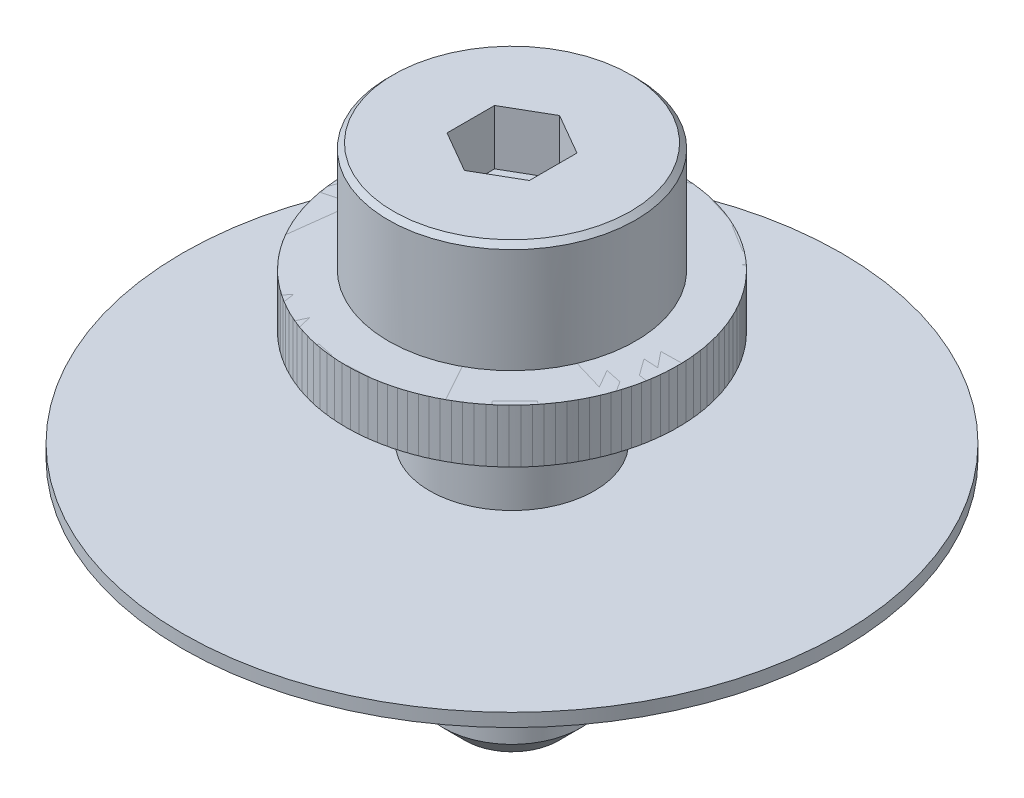
ISO-10303-21;
HEADER;
FILE_DESCRIPTION(('STEP AP214'),'2;1');
FILE_NAME('part.step','',(''),(''),'','','');
FILE_SCHEMA(('AUTOMOTIVE_DESIGN { 1 0 10303 214 1 1 1 1 }'));
ENDSEC;
DATA;
#1=APPLICATION_CONTEXT('core data for automotive mechanical design processes');
#2=APPLICATION_PROTOCOL_DEFINITION('international standard','automotive_design',2000,#1);
#3=PRODUCT_CONTEXT('',#1,'mechanical');
#4=PRODUCT('Part','Part','',(#3));
#5=PRODUCT_RELATED_PRODUCT_CATEGORY('part','',(#4));
#6=PRODUCT_DEFINITION_FORMATION('','',#4);
#7=PRODUCT_DEFINITION_CONTEXT('part definition',#1,'design');
#8=PRODUCT_DEFINITION('design','',#6,#7);
#9=PRODUCT_DEFINITION_SHAPE('','',#8);
#10=(LENGTH_UNIT() NAMED_UNIT(*) SI_UNIT(.MILLI.,.METRE.));
#11=(NAMED_UNIT(*) PLANE_ANGLE_UNIT() SI_UNIT($,.RADIAN.));
#12=(NAMED_UNIT(*) SI_UNIT($,.STERADIAN.) SOLID_ANGLE_UNIT());
#13=UNCERTAINTY_MEASURE_WITH_UNIT(LENGTH_MEASURE(1.E-05),#10,'distance_accuracy_value','');
#14=(GEOMETRIC_REPRESENTATION_CONTEXT(3) GLOBAL_UNCERTAINTY_ASSIGNED_CONTEXT((#13)) GLOBAL_UNIT_ASSIGNED_CONTEXT((#10,
#11,#12)) REPRESENTATION_CONTEXT('',''));
#15=CARTESIAN_POINT('',(0.,0.,0.));
#16=DIRECTION('',(0.,0.,1.));
#17=DIRECTION('',(1.,0.,0.));
#18=AXIS2_PLACEMENT_3D('',#15,#16,#17);
#19=CARTESIAN_POINT('',(0.,-3.0988,0.));
#20=DIRECTION('',(0.,1.,0.));
#21=DIRECTION('',(0.,0.,1.));
#22=AXIS2_PLACEMENT_3D('',#19,#20,#21);
#23=CYLINDRICAL_SURFACE('',#22,9.5885);
#24=CARTESIAN_POINT('',(0.,-3.0988,0.));
#25=DIRECTION('',(0.,-1.,0.));
#26=DIRECTION('',(0.,0.,-1.));
#27=AXIS2_PLACEMENT_3D('',#24,#25,#26);
#28=CIRCLE('',#27,9.5885);
#29=CARTESIAN_POINT('',(0.,-3.0988,-9.5885));
#30=VERTEX_POINT('',#29);
#31=EDGE_CURVE('P0_E10',#30,#30,#28,.T.);
#32=ORIENTED_EDGE('',*,*,#31,.F.);
#33=EDGE_LOOP('',(#32));
#34=FACE_BOUND('',#33,.T.);
#35=CARTESIAN_POINT('',(0.,0.,0.));
#36=DIRECTION('',(0.,-1.,0.));
#37=DIRECTION('',(0.,0.,-1.));
#38=AXIS2_PLACEMENT_3D('',#35,#36,#37);
#39=CIRCLE('',#38,9.5885);
#40=CARTESIAN_POINT('',(0.,0.,-9.5885));
#41=VERTEX_POINT('',#40);
#42=EDGE_CURVE('P0_E37',#41,#41,#39,.T.);
#43=ORIENTED_EDGE('',*,*,#42,.T.);
#44=EDGE_LOOP('',(#43));
#45=FACE_BOUND('',#44,.T.);
#46=ADVANCED_FACE('P0_F34',(#34,#45),#23,.T.);
#47=CARTESIAN_POINT('',(0.,-3.0988,0.));
#48=DIRECTION('',(0.,-1.,0.));
#49=DIRECTION('',(0.,0.,-1.));
#50=AXIS2_PLACEMENT_3D('',#47,#48,#49);
#51=PLANE('',#50);
#52=ORIENTED_EDGE('',*,*,#31,.T.);
#53=EDGE_LOOP('',(#52));
#54=FACE_BOUND('',#53,.T.);
#55=ADVANCED_FACE('P0_F51',(#54),#51,.T.);
#56=CARTESIAN_POINT('',(0.,0.,0.));
#57=DIRECTION('',(0.,-1.,0.));
#58=DIRECTION('',(0.,0.,-1.));
#59=AXIS2_PLACEMENT_3D('',#56,#57,#58);
#60=PLANE('',#59);
#61=ORIENTED_EDGE('',*,*,#42,.F.);
#62=EDGE_LOOP('',(#61));
#63=FACE_BOUND('',#62,.T.);
#64=ADVANCED_FACE('P0_F49',(#63),#60,.F.);
#65=CLOSED_SHELL('',(#46,#55,#64));
#66=MANIFOLD_SOLID_BREP('P0_B2',#65);
#67=CARTESIAN_POINT('',(0.,-9.4488,0.));
#68=DIRECTION('',(0.,1.,0.));
#69=DIRECTION('',(0.,0.,1.));
#70=AXIS2_PLACEMENT_3D('',#67,#68,#69);
#71=PLANE('',#70);
#72=CARTESIAN_POINT('',(0.,-9.4488,0.));
#73=DIRECTION('',(0.,1.,0.));
#74=DIRECTION('',(0.,0.,1.));
#75=AXIS2_PLACEMENT_3D('',#72,#73,#74);
#76=CIRCLE('',#75,19.05);
#77=CARTESIAN_POINT('',(0.,-9.4488,-19.05));
#78=VERTEX_POINT('',#77);
#79=EDGE_CURVE('P1_E32',#78,#78,#76,.T.);
#80=ORIENTED_EDGE('',*,*,#79,.F.);
#81=EDGE_LOOP('',(#80));
#82=FACE_BOUND('',#81,.T.);
#83=CARTESIAN_POINT('',(0.,-9.4488,0.));
#84=DIRECTION('',(0.,1.,0.));
#85=DIRECTION('',(0.,0.,1.));
#86=AXIS2_PLACEMENT_3D('',#83,#84,#85);
#87=CIRCLE('',#86,4.7625);
#88=CARTESIAN_POINT('',(0.,-9.4488,-4.7625));
#89=VERTEX_POINT('',#88);
#90=EDGE_CURVE('P1_E26',#89,#89,#87,.T.);
#91=ORIENTED_EDGE('',*,*,#90,.T.);
#92=EDGE_LOOP('',(#91));
#93=FACE_BOUND('',#92,.T.);
#94=ADVANCED_FACE('P1_F14',(#82,#93),#71,.F.);
#95=CARTESIAN_POINT('',(0.,-8.6868,0.));
#96=DIRECTION('',(0.,-1.,0.));
#97=DIRECTION('',(0.,0.,-1.));
#98=AXIS2_PLACEMENT_3D('',#95,#96,#97);
#99=CYLINDRICAL_SURFACE('',#98,19.05);
#100=CARTESIAN_POINT('',(0.,-8.6868,0.));
#101=DIRECTION('',(0.,1.,0.));
#102=DIRECTION('',(0.,0.,1.));
#103=AXIS2_PLACEMENT_3D('',#100,#101,#102);
#104=CIRCLE('',#103,19.05);
#105=CARTESIAN_POINT('',(0.,-8.6868,-19.05));
#106=VERTEX_POINT('',#105);
#107=EDGE_CURVE('P1_E21',#106,#106,#104,.T.);
#108=CARTESIAN_POINT('',(0.,-8.6868,-19.05));
#109=CARTESIAN_POINT('',(0.,-8.6947375,-19.05));
#110=CARTESIAN_POINT('',(0.,-8.702675,-19.05));
#111=CARTESIAN_POINT('',(0.,-8.71855,-19.05));
#112=CARTESIAN_POINT('',(0.,-8.7264875,-19.05));
#113=CARTESIAN_POINT('',(0.,-8.7423625,-19.05));
#114=CARTESIAN_POINT('',(0.,-8.7503,-19.05));
#115=CARTESIAN_POINT('',(0.,-8.766175,-19.05));
#116=CARTESIAN_POINT('',(0.,-8.7741125,-19.05));
#117=CARTESIAN_POINT('',(0.,-8.7899875,-19.05));
#118=CARTESIAN_POINT('',(0.,-8.797925,-19.05));
#119=CARTESIAN_POINT('',(0.,-8.8138,-19.05));
#120=CARTESIAN_POINT('',(0.,-8.8217375,-19.05));
#121=CARTESIAN_POINT('',(0.,-8.8376125,-19.05));
#122=CARTESIAN_POINT('',(0.,-8.84555,-19.05));
#123=CARTESIAN_POINT('',(0.,-8.861425,-19.05));
#124=CARTESIAN_POINT('',(0.,-8.8693625,-19.05));
#125=CARTESIAN_POINT('',(0.,-8.8852375,-19.05));
#126=CARTESIAN_POINT('',(0.,-8.893175,-19.05));
#127=CARTESIAN_POINT('',(0.,-8.90905,-19.05));
#128=CARTESIAN_POINT('',(0.,-8.9169875,-19.05));
#129=CARTESIAN_POINT('',(0.,-8.9328625,-19.05));
#130=CARTESIAN_POINT('',(0.,-8.9408,-19.05));
#131=CARTESIAN_POINT('',(0.,-8.956675,-19.05));
#132=CARTESIAN_POINT('',(0.,-8.9646125,-19.05));
#133=CARTESIAN_POINT('',(0.,-8.9804875,-19.05));
#134=CARTESIAN_POINT('',(0.,-8.988425,-19.05));
#135=CARTESIAN_POINT('',(0.,-9.0043,-19.05));
#136=CARTESIAN_POINT('',(0.,-9.0122375,-19.05));
#137=CARTESIAN_POINT('',(0.,-9.0281125,-19.05));
#138=CARTESIAN_POINT('',(0.,-9.03605,-19.05));
#139=CARTESIAN_POINT('',(0.,-9.051925,-19.05));
#140=CARTESIAN_POINT('',(0.,-9.0598625,-19.05));
#141=CARTESIAN_POINT('',(0.,-9.0757375,-19.05));
#142=CARTESIAN_POINT('',(0.,-9.083675,-19.05));
#143=CARTESIAN_POINT('',(0.,-9.09955,-19.05));
#144=CARTESIAN_POINT('',(0.,-9.1074875,-19.05));
#145=CARTESIAN_POINT('',(0.,-9.1233625,-19.05));
#146=CARTESIAN_POINT('',(0.,-9.1313,-19.05));
#147=CARTESIAN_POINT('',(0.,-9.147175,-19.05));
#148=CARTESIAN_POINT('',(0.,-9.1551125,-19.05));
#149=CARTESIAN_POINT('',(0.,-9.1709875,-19.05));
#150=CARTESIAN_POINT('',(0.,-9.178925,-19.05));
#151=CARTESIAN_POINT('',(0.,-9.1948,-19.05));
#152=CARTESIAN_POINT('',(0.,-9.2027375,-19.05));
#153=CARTESIAN_POINT('',(0.,-9.2186125,-19.05));
#154=CARTESIAN_POINT('',(0.,-9.22655,-19.05));
#155=CARTESIAN_POINT('',(0.,-9.242425,-19.05));
#156=CARTESIAN_POINT('',(0.,-9.2503625,-19.05));
#157=CARTESIAN_POINT('',(0.,-9.2662375,-19.05));
#158=CARTESIAN_POINT('',(0.,-9.274175,-19.05));
#159=CARTESIAN_POINT('',(0.,-9.29005,-19.05));
#160=CARTESIAN_POINT('',(0.,-9.2979875,-19.05));
#161=CARTESIAN_POINT('',(0.,-9.3138625,-19.05));
#162=CARTESIAN_POINT('',(0.,-9.3218,-19.05));
#163=CARTESIAN_POINT('',(0.,-9.337675,-19.05));
#164=CARTESIAN_POINT('',(0.,-9.3456125,-19.05));
#165=CARTESIAN_POINT('',(0.,-9.3614875,-19.05));
#166=CARTESIAN_POINT('',(0.,-9.369425,-19.05));
#167=CARTESIAN_POINT('',(0.,-9.3853,-19.05));
#168=CARTESIAN_POINT('',(0.,-9.3932375,-19.05));
#169=CARTESIAN_POINT('',(0.,-9.4091125,-19.05));
#170=CARTESIAN_POINT('',(0.,-9.41705,-19.05));
#171=CARTESIAN_POINT('',(0.,-9.432925,-19.05));
#172=CARTESIAN_POINT('',(0.,-9.4408625,-19.05));
#173=CARTESIAN_POINT('',(0.,-9.4488,-19.05));
#174=B_SPLINE_CURVE_WITH_KNOTS('',3,(#108,#109,#110,#111,#112,#113,#114,#115,#116,#117,#118,
#119,#120,#121,#122,#123,#124,#125,#126,#127,#128,#129,#130,#131,#132,#133,#134,#135,#136,#137,
#138,#139,#140,#141,#142,#143,#144,#145,#146,#147,#148,#149,#150,#151,#152,#153,#154,#155,#156,
#157,#158,#159,#160,#161,#162,#163,#164,#165,#166,#167,#168,#169,#170,#171,#172,#173),
.UNSPECIFIED.,.F.,.F.,(4,2,2,2,2,2,2,2,2,2,2,2,2,2,2,2,2,2,2,2,2,2,2,2,2,2,2,2,2,2,2,2,4),(0.,
0.0238125000000013,0.0476250000000008,0.0714375000000003,0.0952500000000016,0.119062500000001,
0.142875000000001,0.1666875,0.190500000000001,0.214312500000001,0.238125,0.261937500000002,
0.285750000000001,0.309562500000001,0.333375,0.357187500000002,0.381000000000001,
0.404812500000001,0.428625000000002,0.452437500000001,0.476250000000001,0.500062500000001,
0.523875000000002,0.547687500000001,0.571500000000001,0.595312500000002,0.619125000000002,
0.642937500000001,0.666750000000001,0.690562500000002,0.714375000000001,0.738187500000001,
0.762000000000002),.UNSPECIFIED.);
#175=EDGE_CURVE('P1_BSEAM38',#106,#78,#174,.T.);
#176=ORIENTED_EDGE('',*,*,#107,.F.);
#177=ORIENTED_EDGE('',*,*,#79,.T.);
#178=ORIENTED_EDGE('',*,*,#175,.T.);
#179=ORIENTED_EDGE('',*,*,#175,.F.);
#180=EDGE_LOOP('',(#176,#178,#177,#179));
#181=FACE_BOUND('',#180,.T.);
#182=ADVANCED_FACE('P1_F38',(#181),#99,.T.);
#183=CARTESIAN_POINT('',(0.,-8.6868,0.));
#184=DIRECTION('',(0.,1.,0.));
#185=DIRECTION('',(0.,0.,1.));
#186=AXIS2_PLACEMENT_3D('',#183,#184,#185);
#187=PLANE('',#186);
#188=ORIENTED_EDGE('',*,*,#107,.T.);
#189=EDGE_LOOP('',(#188));
#190=FACE_BOUND('',#189,.T.);
#191=CARTESIAN_POINT('',(0.,-8.6868,0.));
#192=DIRECTION('',(0.,1.,0.));
#193=DIRECTION('',(0.,0.,1.));
#194=AXIS2_PLACEMENT_3D('',#191,#192,#193);
#195=CIRCLE('',#194,4.7625);
#196=CARTESIAN_POINT('',(0.,-8.6868,-4.7625));
#197=VERTEX_POINT('',#196);
#198=EDGE_CURVE('P1_E10',#197,#197,#195,.T.);
#199=ORIENTED_EDGE('',*,*,#198,.F.);
#200=EDGE_LOOP('',(#199));
#201=FACE_BOUND('',#200,.T.);
#202=ADVANCED_FACE('P1_F46',(#190,#201),#187,.T.);
#203=CARTESIAN_POINT('',(0.,-8.6868,0.));
#204=DIRECTION('',(0.,-1.,0.));
#205=DIRECTION('',(0.,0.,-1.));
#206=AXIS2_PLACEMENT_3D('',#203,#204,#205);
#207=CYLINDRICAL_SURFACE('',#206,4.7625);
#208=CARTESIAN_POINT('',(0.,-8.6868,-4.7625));
#209=CARTESIAN_POINT('',(0.,-8.6947375,-4.7625));
#210=CARTESIAN_POINT('',(0.,-8.702675,-4.7625));
#211=CARTESIAN_POINT('',(0.,-8.71855,-4.7625));
#212=CARTESIAN_POINT('',(0.,-8.7264875,-4.7625));
#213=CARTESIAN_POINT('',(0.,-8.7423625,-4.7625));
#214=CARTESIAN_POINT('',(0.,-8.7503,-4.7625));
#215=CARTESIAN_POINT('',(0.,-8.766175,-4.7625));
#216=CARTESIAN_POINT('',(0.,-8.7741125,-4.7625));
#217=CARTESIAN_POINT('',(0.,-8.7899875,-4.7625));
#218=CARTESIAN_POINT('',(0.,-8.797925,-4.7625));
#219=CARTESIAN_POINT('',(0.,-8.8138,-4.7625));
#220=CARTESIAN_POINT('',(0.,-8.8217375,-4.7625));
#221=CARTESIAN_POINT('',(0.,-8.8376125,-4.7625));
#222=CARTESIAN_POINT('',(0.,-8.84555,-4.7625));
#223=CARTESIAN_POINT('',(0.,-8.861425,-4.7625));
#224=CARTESIAN_POINT('',(0.,-8.8693625,-4.7625));
#225=CARTESIAN_POINT('',(0.,-8.8852375,-4.7625));
#226=CARTESIAN_POINT('',(0.,-8.893175,-4.7625));
#227=CARTESIAN_POINT('',(0.,-8.90905,-4.7625));
#228=CARTESIAN_POINT('',(0.,-8.9169875,-4.7625));
#229=CARTESIAN_POINT('',(0.,-8.9328625,-4.7625));
#230=CARTESIAN_POINT('',(0.,-8.9408,-4.7625));
#231=CARTESIAN_POINT('',(0.,-8.956675,-4.7625));
#232=CARTESIAN_POINT('',(0.,-8.9646125,-4.7625));
#233=CARTESIAN_POINT('',(0.,-8.9804875,-4.7625));
#234=CARTESIAN_POINT('',(0.,-8.988425,-4.7625));
#235=CARTESIAN_POINT('',(0.,-9.0043,-4.7625));
#236=CARTESIAN_POINT('',(0.,-9.0122375,-4.7625));
#237=CARTESIAN_POINT('',(0.,-9.0281125,-4.7625));
#238=CARTESIAN_POINT('',(0.,-9.03605,-4.7625));
#239=CARTESIAN_POINT('',(0.,-9.051925,-4.7625));
#240=CARTESIAN_POINT('',(0.,-9.0598625,-4.7625));
#241=CARTESIAN_POINT('',(0.,-9.0757375,-4.7625));
#242=CARTESIAN_POINT('',(0.,-9.083675,-4.7625));
#243=CARTESIAN_POINT('',(0.,-9.09955,-4.7625));
#244=CARTESIAN_POINT('',(0.,-9.1074875,-4.7625));
#245=CARTESIAN_POINT('',(0.,-9.1233625,-4.7625));
#246=CARTESIAN_POINT('',(0.,-9.1313,-4.7625));
#247=CARTESIAN_POINT('',(0.,-9.147175,-4.7625));
#248=CARTESIAN_POINT('',(0.,-9.1551125,-4.7625));
#249=CARTESIAN_POINT('',(0.,-9.1709875,-4.7625));
#250=CARTESIAN_POINT('',(0.,-9.178925,-4.7625));
#251=CARTESIAN_POINT('',(0.,-9.1948,-4.7625));
#252=CARTESIAN_POINT('',(0.,-9.2027375,-4.7625));
#253=CARTESIAN_POINT('',(0.,-9.2186125,-4.7625));
#254=CARTESIAN_POINT('',(0.,-9.22655,-4.7625));
#255=CARTESIAN_POINT('',(0.,-9.242425,-4.7625));
#256=CARTESIAN_POINT('',(0.,-9.2503625,-4.7625));
#257=CARTESIAN_POINT('',(0.,-9.2662375,-4.7625));
#258=CARTESIAN_POINT('',(0.,-9.274175,-4.7625));
#259=CARTESIAN_POINT('',(0.,-9.29005,-4.7625));
#260=CARTESIAN_POINT('',(0.,-9.2979875,-4.7625));
#261=CARTESIAN_POINT('',(0.,-9.3138625,-4.7625));
#262=CARTESIAN_POINT('',(0.,-9.3218,-4.7625));
#263=CARTESIAN_POINT('',(0.,-9.337675,-4.7625));
#264=CARTESIAN_POINT('',(0.,-9.3456125,-4.7625));
#265=CARTESIAN_POINT('',(0.,-9.3614875,-4.7625));
#266=CARTESIAN_POINT('',(0.,-9.369425,-4.7625));
#267=CARTESIAN_POINT('',(0.,-9.3853,-4.7625));
#268=CARTESIAN_POINT('',(0.,-9.3932375,-4.7625));
#269=CARTESIAN_POINT('',(0.,-9.4091125,-4.7625));
#270=CARTESIAN_POINT('',(0.,-9.41705,-4.7625));
#271=CARTESIAN_POINT('',(0.,-9.432925,-4.7625));
#272=CARTESIAN_POINT('',(0.,-9.4408625,-4.7625));
#273=CARTESIAN_POINT('',(0.,-9.4488,-4.7625));
#274=B_SPLINE_CURVE_WITH_KNOTS('',3,(#208,#209,#210,#211,#212,#213,#214,#215,#216,#217,#218,
#219,#220,#221,#222,#223,#224,#225,#226,#227,#228,#229,#230,#231,#232,#233,#234,#235,#236,#237,
#238,#239,#240,#241,#242,#243,#244,#245,#246,#247,#248,#249,#250,#251,#252,#253,#254,#255,#256,
#257,#258,#259,#260,#261,#262,#263,#264,#265,#266,#267,#268,#269,#270,#271,#272,#273),
.UNSPECIFIED.,.F.,.F.,(4,2,2,2,2,2,2,2,2,2,2,2,2,2,2,2,2,2,2,2,2,2,2,2,2,2,2,2,2,2,2,2,4),(0.,
0.0238124999999995,0.0476249999999991,0.0714374999999986,0.0952499999999998,0.119062499999999,
0.142874999999999,0.166687499999998,0.1905,0.214312499999999,0.238124999999999,0.2619375,
0.28575,0.309562499999999,0.333374999999999,0.3571875,0.380999999999999,0.404812499999999,
0.428625,0.4524375,0.476249999999999,0.500062499999999,0.523875,0.5476875,0.571499999999999,
0.5953125,0.619125,0.642937499999999,0.666749999999999,0.6905625,0.714375,0.738187499999999,
0.762000000000001),.UNSPECIFIED.);
#275=EDGE_CURVE('P1_BSEAM16',#197,#89,#274,.T.);
#276=ORIENTED_EDGE('',*,*,#198,.T.);
#277=ORIENTED_EDGE('',*,*,#90,.F.);
#278=ORIENTED_EDGE('',*,*,#275,.T.);
#279=ORIENTED_EDGE('',*,*,#275,.F.);
#280=EDGE_LOOP('',(#276,#278,#277,#279));
#281=FACE_BOUND('',#280,.T.);
#282=ADVANCED_FACE('P1_F16',(#281),#207,.F.);
#283=CLOSED_SHELL('',(#94,#182,#202,#282));
#284=MANIFOLD_SOLID_BREP('P1_B1',#283);
#285=CARTESIAN_POINT('',(0.,6.35,0.));
#286=DIRECTION('',(0.,-1.,0.));
#287=DIRECTION('',(0.,0.,-1.));
#288=AXIS2_PLACEMENT_3D('',#285,#286,#287);
#289=CYLINDRICAL_SURFACE('',#288,7.14375);
#290=CARTESIAN_POINT('',(0.,0.,0.));
#291=DIRECTION('',(0.,-1.,0.));
#292=DIRECTION('',(0.,0.,-1.));
#293=AXIS2_PLACEMENT_3D('',#290,#291,#292);
#294=CIRCLE('',#293,7.14375);
#295=CARTESIAN_POINT('',(0.,0.,-7.14375));
#296=VERTEX_POINT('',#295);
#297=EDGE_CURVE('P2_E11',#296,#296,#294,.F.);
#298=ORIENTED_EDGE('',*,*,#297,.T.);
#299=EDGE_LOOP('',(#298));
#300=FACE_BOUND('',#299,.T.);
#301=CARTESIAN_POINT('',(0.,6.05864879756294,0.));
#302=DIRECTION('',(0.,-1.,0.));
#303=DIRECTION('',(0.,0.,-1.));
#304=AXIS2_PLACEMENT_3D('',#301,#302,#303);
#305=CIRCLE('',#304,7.14375);
#306=CARTESIAN_POINT('',(0.,6.05864879756294,-7.14375));
#307=VERTEX_POINT('',#306);
#308=EDGE_CURVE('P2_E22',#307,#307,#305,.T.);
#309=ORIENTED_EDGE('',*,*,#308,.T.);
#310=EDGE_LOOP('',(#309));
#311=FACE_BOUND('',#310,.T.);
#312=ADVANCED_FACE('P2_F16',(#300,#311),#289,.T.);
#313=CARTESIAN_POINT('',(0.,6.05864879764795,0.));
#314=DIRECTION('',(0.,-1.,0.));
#315=DIRECTION('',(1.,0.,0.));
#316=AXIS2_PLACEMENT_3D('',#313,#314,#315);
#317=CONICAL_SURFACE('',#316,7.14374999995471,0.785398163397448);
#318=ORIENTED_EDGE('',*,*,#308,.F.);
#319=EDGE_LOOP('',(#318));
#320=FACE_BOUND('',#319,.T.);
#321=CARTESIAN_POINT('',(0.,6.35000000005448,0.));
#322=DIRECTION('',(0.,-1.,0.));
#323=DIRECTION('',(1.,0.,0.));
#324=AXIS2_PLACEMENT_3D('',#321,#322,#323);
#325=CIRCLE('',#324,6.85239879754818);
#326=CARTESIAN_POINT('',(6.85239879754818,6.35000000005448,0.));
#327=VERTEX_POINT('',#326);
#328=EDGE_CURVE('P2_E127',#327,#327,#325,.T.);
#329=ORIENTED_EDGE('',*,*,#328,.T.);
#330=EDGE_LOOP('',(#329));
#331=FACE_BOUND('',#330,.T.);
#332=ADVANCED_FACE('P2_F121',(#320,#331),#317,.T.);
#333=CARTESIAN_POINT('',(-2.38125,3.175,-4.12444598552339));
#334=DIRECTION('',(0.,1.,0.));
#335=DIRECTION('',(0.,0.,1.));
#336=AXIS2_PLACEMENT_3D('',#333,#334,#335);
#337=PLANE('',#336);
#338=DIRECTION('',(0.866025403784439,0.,0.5));
#339=VECTOR('',#338,1.);
#340=CARTESIAN_POINT('',(-2.38125,3.175,1.3748153285078));
#341=LINE('',#340,#339);
#342=CARTESIAN_POINT('',(-2.38125,3.175,1.3748153285078));
#343=VERTEX_POINT('',#342);
#344=CARTESIAN_POINT('',(0.,3.175,2.74963065701559));
#345=VERTEX_POINT('',#344);
#346=EDGE_CURVE('P2_E104',#343,#345,#341,.T.);
#347=ORIENTED_EDGE('',*,*,#346,.T.);
#348=DIRECTION('',(-0.866025403784439,0.,0.5));
#349=VECTOR('',#348,1.);
#350=CARTESIAN_POINT('',(2.38125,3.175,1.3748153285078));
#351=LINE('',#350,#349);
#352=CARTESIAN_POINT('',(2.38125,3.175,1.3748153285078));
#353=VERTEX_POINT('',#352);
#354=EDGE_CURVE('P2_E110',#353,#345,#351,.T.);
#355=ORIENTED_EDGE('',*,*,#354,.F.);
#356=DIRECTION('',(0.,0.,1.));
#357=VECTOR('',#356,1.);
#358=CARTESIAN_POINT('',(2.38125,3.175,-1.3748153285078));
#359=LINE('',#358,#357);
#360=CARTESIAN_POINT('',(2.38125,3.175,-1.3748153285078));
#361=VERTEX_POINT('',#360);
#362=EDGE_CURVE('P2_E114',#361,#353,#359,.T.);
#363=ORIENTED_EDGE('',*,*,#362,.F.);
#364=DIRECTION('',(0.866025403784439,0.,0.5));
#365=VECTOR('',#364,1.);
#366=CARTESIAN_POINT('',(0.,3.175,-2.74963065701559));
#367=LINE('',#366,#365);
#368=CARTESIAN_POINT('',(0.,3.175,-2.74963065701559));
#369=VERTEX_POINT('',#368);
#370=EDGE_CURVE('P2_E116',#369,#361,#367,.T.);
#371=ORIENTED_EDGE('',*,*,#370,.F.);
#372=DIRECTION('',(-0.866025403784439,0.,0.5));
#373=VECTOR('',#372,1.);
#374=CARTESIAN_POINT('',(0.,3.175,-2.74963065701559));
#375=LINE('',#374,#373);
#376=CARTESIAN_POINT('',(-2.38125,3.175,-1.3748153285078));
#377=VERTEX_POINT('',#376);
#378=EDGE_CURVE('P2_E89',#369,#377,#375,.T.);
#379=ORIENTED_EDGE('',*,*,#378,.T.);
#380=DIRECTION('',(0.,0.,1.));
#381=VECTOR('',#380,1.);
#382=CARTESIAN_POINT('',(-2.38125,3.175,-1.3748153285078));
#383=LINE('',#382,#381);
#384=EDGE_CURVE('P2_E93',#377,#343,#383,.T.);
#385=ORIENTED_EDGE('',*,*,#384,.T.);
#386=EDGE_LOOP('',(#347,#355,#363,#371,#379,#385));
#387=FACE_BOUND('',#386,.T.);
#388=ADVANCED_FACE('P2_F124',(#387),#337,.T.);
#389=CARTESIAN_POINT('',(0.,3.175,-2.74963065701559));
#390=DIRECTION('',(0.5,0.,-0.866025403784439));
#391=DIRECTION('',(0.866025403784439,0.,0.5));
#392=AXIS2_PLACEMENT_3D('',#389,#390,#391);
#393=PLANE('',#392);
#394=DIRECTION('',(0.,1.,0.));
#395=VECTOR('',#394,1.);
#396=CARTESIAN_POINT('',(2.38125,3.175,-1.3748153285078));
#397=LINE('',#396,#395);
#398=CARTESIAN_POINT('',(2.38125,6.35,-1.3748153285078));
#399=VERTEX_POINT('',#398);
#400=EDGE_CURVE('P2_E32',#361,#399,#397,.T.);
#401=ORIENTED_EDGE('',*,*,#400,.T.);
#402=DIRECTION('',(-0.866025403784439,0.,-0.5));
#403=VECTOR('',#402,1.);
#404=CARTESIAN_POINT('',(2.38125,6.35,-1.3748153285078));
#405=LINE('',#404,#403);
#406=CARTESIAN_POINT('',(0.,6.35,-2.7496306570156));
#407=VERTEX_POINT('',#406);
#408=EDGE_CURVE('P2_E72',#399,#407,#405,.T.);
#409=ORIENTED_EDGE('',*,*,#408,.T.);
#410=DIRECTION('',(0.,1.,0.));
#411=VECTOR('',#410,1.);
#412=CARTESIAN_POINT('',(0.,3.175,-2.74963065701559));
#413=LINE('',#412,#411);
#414=EDGE_CURVE('P2_E83',#407,#369,#413,.F.);
#415=ORIENTED_EDGE('',*,*,#414,.T.);
#416=ORIENTED_EDGE('',*,*,#370,.T.);
#417=EDGE_LOOP('',(#401,#409,#415,#416));
#418=FACE_BOUND('',#417,.T.);
#419=ADVANCED_FACE('P2_F81',(#418),#393,.F.);
#420=CARTESIAN_POINT('',(2.38125,3.175,-1.3748153285078));
#421=DIRECTION('',(1.,0.,0.));
#422=DIRECTION('',(0.,0.,1.));
#423=AXIS2_PLACEMENT_3D('',#420,#421,#422);
#424=PLANE('',#423);
#425=DIRECTION('',(0.,1.,0.));
#426=VECTOR('',#425,1.);
#427=CARTESIAN_POINT('',(2.38125,3.175,1.3748153285078));
#428=LINE('',#427,#426);
#429=CARTESIAN_POINT('',(2.38125,6.35,1.3748153285078));
#430=VERTEX_POINT('',#429);
#431=EDGE_CURVE('P2_E107',#353,#430,#428,.T.);
#432=ORIENTED_EDGE('',*,*,#431,.T.);
#433=DIRECTION('',(0.,0.,1.));
#434=VECTOR('',#433,1.);
#435=CARTESIAN_POINT('',(2.38125,6.35,0.));
#436=LINE('',#435,#434);
#437=EDGE_CURVE('P2_E85',#430,#399,#436,.F.);
#438=ORIENTED_EDGE('',*,*,#437,.T.);
#439=ORIENTED_EDGE('',*,*,#400,.F.);
#440=ORIENTED_EDGE('',*,*,#362,.T.);
#441=EDGE_LOOP('',(#432,#438,#439,#440));
#442=FACE_BOUND('',#441,.T.);
#443=ADVANCED_FACE('P2_F136',(#442),#424,.F.);
#444=CARTESIAN_POINT('',(2.38125,3.175,1.3748153285078));
#445=DIRECTION('',(0.5,0.,0.866025403784439));
#446=DIRECTION('',(-0.866025403784439,0.,0.5));
#447=AXIS2_PLACEMENT_3D('',#444,#445,#446);
#448=PLANE('',#447);
#449=DIRECTION('',(0.,1.,0.));
#450=VECTOR('',#449,1.);
#451=CARTESIAN_POINT('',(0.,3.175,2.74963065701559));
#452=LINE('',#451,#450);
#453=CARTESIAN_POINT('',(0.,6.35,2.74963065701559));
#454=VERTEX_POINT('',#453);
#455=EDGE_CURVE('P2_E101',#345,#454,#452,.T.);
#456=ORIENTED_EDGE('',*,*,#455,.T.);
#457=DIRECTION('',(0.866025403784439,0.,-0.5));
#458=VECTOR('',#457,1.);
#459=CARTESIAN_POINT('',(0.,6.35,2.74963065701559));
#460=LINE('',#459,#458);
#461=EDGE_CURVE('P2_E133',#454,#430,#460,.T.);
#462=ORIENTED_EDGE('',*,*,#461,.T.);
#463=ORIENTED_EDGE('',*,*,#431,.F.);
#464=ORIENTED_EDGE('',*,*,#354,.T.);
#465=EDGE_LOOP('',(#456,#462,#463,#464));
#466=FACE_BOUND('',#465,.T.);
#467=ADVANCED_FACE('P2_F139',(#466),#448,.F.);
#468=CARTESIAN_POINT('',(-2.38125,3.175,1.3748153285078));
#469=DIRECTION('',(-0.5,0.,0.866025403784439));
#470=DIRECTION('',(0.866025403784439,0.,0.5));
#471=AXIS2_PLACEMENT_3D('',#468,#469,#470);
#472=PLANE('',#471);
#473=ORIENTED_EDGE('',*,*,#455,.F.);
#474=ORIENTED_EDGE('',*,*,#346,.F.);
#475=DIRECTION('',(0.,1.,0.));
#476=VECTOR('',#475,1.);
#477=CARTESIAN_POINT('',(-2.38125,3.175,1.3748153285078));
#478=LINE('',#477,#476);
#479=CARTESIAN_POINT('',(-2.38125,6.35,1.3748153285078));
#480=VERTEX_POINT('',#479);
#481=EDGE_CURVE('P2_E90',#343,#480,#478,.T.);
#482=ORIENTED_EDGE('',*,*,#481,.T.);
#483=DIRECTION('',(-0.866025403784439,0.,-0.5));
#484=VECTOR('',#483,1.);
#485=CARTESIAN_POINT('',(0.,6.35,2.74963065701559));
#486=LINE('',#485,#484);
#487=EDGE_CURVE('P2_E129',#454,#480,#486,.T.);
#488=ORIENTED_EDGE('',*,*,#487,.F.);
#489=EDGE_LOOP('',(#473,#474,#482,#488));
#490=FACE_BOUND('',#489,.T.);
#491=ADVANCED_FACE('P2_F143',(#490),#472,.F.);
#492=CARTESIAN_POINT('',(-2.38125,3.175,-1.3748153285078));
#493=DIRECTION('',(-1.,0.,0.));
#494=DIRECTION('',(0.,0.,1.));
#495=AXIS2_PLACEMENT_3D('',#492,#493,#494);
#496=PLANE('',#495);
#497=ORIENTED_EDGE('',*,*,#481,.F.);
#498=ORIENTED_EDGE('',*,*,#384,.F.);
#499=DIRECTION('',(0.,1.,0.));
#500=VECTOR('',#499,1.);
#501=CARTESIAN_POINT('',(-2.38125,3.175,-1.3748153285078));
#502=LINE('',#501,#500);
#503=CARTESIAN_POINT('',(-2.38125,6.35,-1.3748153285078));
#504=VERTEX_POINT('',#503);
#505=EDGE_CURVE('P2_E95',#377,#504,#502,.T.);
#506=ORIENTED_EDGE('',*,*,#505,.T.);
#507=DIRECTION('',(0.,0.,1.));
#508=VECTOR('',#507,1.);
#509=CARTESIAN_POINT('',(-2.38125,6.35,0.));
#510=LINE('',#509,#508);
#511=EDGE_CURVE('P2_E74',#480,#504,#510,.F.);
#512=ORIENTED_EDGE('',*,*,#511,.F.);
#513=EDGE_LOOP('',(#497,#498,#506,#512));
#514=FACE_BOUND('',#513,.T.);
#515=ADVANCED_FACE('P2_F147',(#514),#496,.F.);
#516=CARTESIAN_POINT('',(0.,3.175,-2.74963065701559));
#517=DIRECTION('',(-0.5,0.,-0.866025403784439));
#518=DIRECTION('',(-0.866025403784439,0.,0.5));
#519=AXIS2_PLACEMENT_3D('',#516,#517,#518);
#520=PLANE('',#519);
#521=ORIENTED_EDGE('',*,*,#505,.F.);
#522=ORIENTED_EDGE('',*,*,#378,.F.);
#523=ORIENTED_EDGE('',*,*,#414,.F.);
#524=DIRECTION('',(0.866025403784439,0.,-0.5));
#525=VECTOR('',#524,1.);
#526=CARTESIAN_POINT('',(-2.38125,6.35,-1.3748153285078));
#527=LINE('',#526,#525);
#528=EDGE_CURVE('P2_E68',#504,#407,#527,.T.);
#529=ORIENTED_EDGE('',*,*,#528,.F.);
#530=EDGE_LOOP('',(#521,#522,#523,#529));
#531=FACE_BOUND('',#530,.T.);
#532=ADVANCED_FACE('P2_F87',(#531),#520,.F.);
#533=CARTESIAN_POINT('',(0.,6.35,0.));
#534=DIRECTION('',(0.,1.,0.));
#535=DIRECTION('',(0.,0.,1.));
#536=AXIS2_PLACEMENT_3D('',#533,#534,#535);
#537=PLANE('',#536);
#538=ORIENTED_EDGE('',*,*,#528,.T.);
#539=ORIENTED_EDGE('',*,*,#408,.F.);
#540=ORIENTED_EDGE('',*,*,#437,.F.);
#541=ORIENTED_EDGE('',*,*,#461,.F.);
#542=ORIENTED_EDGE('',*,*,#487,.T.);
#543=ORIENTED_EDGE('',*,*,#511,.T.);
#544=EDGE_LOOP('',(#538,#539,#540,#541,#542,#543));
#545=FACE_BOUND('',#544,.T.);
#546=ORIENTED_EDGE('',*,*,#328,.F.);
#547=EDGE_LOOP('',(#546));
#548=FACE_BOUND('',#547,.T.);
#549=ADVANCED_FACE('P2_F70',(#545,#548),#537,.T.);
#550=OPEN_SHELL('',(#312,#332,#388,#419,#443,#467,#491,#515,#532,#549));
#551=SHELL_BASED_SURFACE_MODEL('P2_B1',(#550));
#552=CARTESIAN_POINT('',(0.,-9.525,0.));
#553=DIRECTION('',(0.,1.,0.));
#554=DIRECTION('',(0.,0.,1.));
#555=AXIS2_PLACEMENT_3D('',#552,#553,#554);
#556=CYLINDRICAL_SURFACE('',#555,4.7625);
#557=CARTESIAN_POINT('',(0.,0.,0.));
#558=DIRECTION('',(0.,1.,0.));
#559=DIRECTION('',(0.,0.,1.));
#560=AXIS2_PLACEMENT_3D('',#557,#558,#559);
#561=CIRCLE('',#560,4.7625);
#562=CARTESIAN_POINT('',(0.,0.,4.7625));
#563=VERTEX_POINT('',#562);
#564=EDGE_CURVE('P3_E11',#563,#563,#561,.F.);
#565=ORIENTED_EDGE('',*,*,#564,.T.);
#566=EDGE_LOOP('',(#565));
#567=FACE_BOUND('',#566,.T.);
#568=CARTESIAN_POINT('',(0.,-9.4488,0.));
#569=DIRECTION('',(0.,-1.,0.));
#570=DIRECTION('',(0.,0.,-1.));
#571=AXIS2_PLACEMENT_3D('',#568,#569,#570);
#572=CIRCLE('',#571,4.7625);
#573=CARTESIAN_POINT('',(0.,-9.4488,-4.7625));
#574=VERTEX_POINT('',#573);
#575=EDGE_CURVE('P3_E24',#574,#574,#572,.F.);
#576=ORIENTED_EDGE('',*,*,#575,.T.);
#577=EDGE_LOOP('',(#576));
#578=FACE_BOUND('',#577,.T.);
#579=ADVANCED_FACE('P3_F16',(#567,#578),#556,.T.);
#580=CARTESIAN_POINT('',(0.,-9.4488,-4.7625));
#581=DIRECTION('',(0.,-1.,0.));
#582=DIRECTION('',(0.,0.,-1.));
#583=AXIS2_PLACEMENT_3D('',#580,#581,#582);
#584=PLANE('',#583);
#585=ORIENTED_EDGE('',*,*,#575,.F.);
#586=EDGE_LOOP('',(#585));
#587=FACE_BOUND('',#586,.T.);
#588=CARTESIAN_POINT('',(0.,-9.4488,0.));
#589=DIRECTION('',(0.,1.,0.));
#590=DIRECTION('',(0.,0.,1.));
#591=AXIS2_PLACEMENT_3D('',#588,#589,#590);
#592=CIRCLE('',#591,3.96875);
#593=CARTESIAN_POINT('',(0.,-9.4488,3.96875));
#594=VERTEX_POINT('',#593);
#595=EDGE_CURVE('P3_E42',#594,#594,#592,.T.);
#596=ORIENTED_EDGE('',*,*,#595,.T.);
#597=EDGE_LOOP('',(#596));
#598=FACE_BOUND('',#597,.T.);
#599=ADVANCED_FACE('P3_F37',(#587,#598),#584,.T.);
#600=CARTESIAN_POINT('',(0.,-22.225,0.));
#601=DIRECTION('',(0.,1.,0.));
#602=DIRECTION('',(0.,0.,1.));
#603=AXIS2_PLACEMENT_3D('',#600,#601,#602);
#604=CYLINDRICAL_SURFACE('',#603,3.96875);
#605=CARTESIAN_POINT('',(0.,-20.955,0.));
#606=DIRECTION('',(0.,1.,0.));
#607=DIRECTION('',(0.,0.,1.));
#608=AXIS2_PLACEMENT_3D('',#605,#606,#607);
#609=CIRCLE('',#608,3.96875);
#610=CARTESIAN_POINT('',(0.,-20.955,3.96875));
#611=VERTEX_POINT('',#610);
#612=EDGE_CURVE('P3_E45',#611,#611,#609,.T.);
#613=ORIENTED_EDGE('',*,*,#612,.T.);
#614=EDGE_LOOP('',(#613));
#615=FACE_BOUND('',#614,.T.);
#616=ORIENTED_EDGE('',*,*,#595,.F.);
#617=EDGE_LOOP('',(#616));
#618=FACE_BOUND('',#617,.T.);
#619=ADVANCED_FACE('P3_F64',(#615,#618),#604,.T.);
#620=CARTESIAN_POINT('',(0.,-20.9550000000149,0.));
#621=DIRECTION('',(0.,1.,0.));
#622=DIRECTION('',(0.,0.,1.));
#623=AXIS2_PLACEMENT_3D('',#620,#621,#622);
#624=CONICAL_SURFACE('',#623,3.96875000006958,0.785398163419827);
#625=CARTESIAN_POINT('',(0.,-22.2249999999917,0.));
#626=DIRECTION('',(0.,1.,0.));
#627=DIRECTION('',(0.,0.,1.));
#628=AXIS2_PLACEMENT_3D('',#625,#626,#627);
#629=CIRCLE('',#628,2.69875000003594);
#630=CARTESIAN_POINT('',(0.,-22.2249999999917,2.69875000003594));
#631=VERTEX_POINT('',#630);
#632=EDGE_CURVE('P3_E55',#631,#631,#629,.T.);
#633=ORIENTED_EDGE('',*,*,#632,.T.);
#634=EDGE_LOOP('',(#633));
#635=FACE_BOUND('',#634,.T.);
#636=ORIENTED_EDGE('',*,*,#612,.F.);
#637=EDGE_LOOP('',(#636));
#638=FACE_BOUND('',#637,.T.);
#639=ADVANCED_FACE('P3_F67',(#635,#638),#624,.T.);
#640=CARTESIAN_POINT('',(0.,-22.225,0.));
#641=DIRECTION('',(0.,-1.,0.));
#642=DIRECTION('',(0.,0.,-1.));
#643=AXIS2_PLACEMENT_3D('',#640,#641,#642);
#644=PLANE('',#643);
#645=ORIENTED_EDGE('',*,*,#632,.F.);
#646=EDGE_LOOP('',(#645));
#647=FACE_BOUND('',#646,.T.);
#648=ADVANCED_FACE('P3_F69',(#647),#644,.T.);
#649=CARTESIAN_POINT('',(0.,0.,0.));
#650=DIRECTION('',(0.,1.,0.));
#651=DIRECTION('',(0.,0.,1.));
#652=AXIS2_PLACEMENT_3D('',#649,#650,#651);
#653=PLANE('',#652);
#654=CARTESIAN_POINT('',(0.,0.,0.));
#655=DIRECTION('',(0.,1.,0.));
#656=DIRECTION('',(0.,0.,1.));
#657=AXIS2_PLACEMENT_3D('',#654,#655,#656);
#658=CIRCLE('',#657,9.5885);
#659=CARTESIAN_POINT('',(0.,0.,9.5885));
#660=VERTEX_POINT('',#659);
#661=EDGE_CURVE('P3_E48',#660,#660,#658,.T.);
#662=ORIENTED_EDGE('',*,*,#661,.F.);
#663=EDGE_LOOP('',(#662));
#664=FACE_BOUND('',#663,.T.);
#665=ORIENTED_EDGE('',*,*,#564,.F.);
#666=EDGE_LOOP('',(#665));
#667=FACE_BOUND('',#666,.T.);
#668=ADVANCED_FACE('P3_F17',(#664,#667),#653,.F.);
#669=CARTESIAN_POINT('',(0.,0.,0.));
#670=DIRECTION('',(0.,-1.,0.));
#671=DIRECTION('',(0.,0.,-1.));
#672=AXIS2_PLACEMENT_3D('',#669,#670,#671);
#673=CYLINDRICAL_SURFACE('',#672,9.5885);
#674=ORIENTED_EDGE('',*,*,#661,.T.);
#675=EDGE_LOOP('',(#674));
#676=FACE_BOUND('',#675,.T.);
#677=CARTESIAN_POINT('',(0.,-3.0988,0.));
#678=DIRECTION('',(0.,1.,0.));
#679=DIRECTION('',(0.,0.,1.));
#680=AXIS2_PLACEMENT_3D('',#677,#678,#679);
#681=CIRCLE('',#680,9.5885);
#682=CARTESIAN_POINT('',(0.,-3.0988,9.5885));
#683=VERTEX_POINT('',#682);
#684=EDGE_CURVE('P3_E19',#683,#683,#681,.T.);
#685=ORIENTED_EDGE('',*,*,#684,.F.);
#686=EDGE_LOOP('',(#685));
#687=FACE_BOUND('',#686,.T.);
#688=ADVANCED_FACE('P3_F81',(#676,#687),#673,.F.);
#689=OPEN_SHELL('',(#579,#599,#619,#639,#648,#668,#688));
#690=SHELL_BASED_SURFACE_MODEL('P3_B1',(#689));
#691=ADVANCED_BREP_SHAPE_REPRESENTATION('',(#18,#66,#284),#14);
#692=MANIFOLD_SURFACE_SHAPE_REPRESENTATION('',(#18,#551,#690),#14);
#693=SHAPE_REPRESENTATION('',(#18),#14);
#694=SHAPE_DEFINITION_REPRESENTATION(#9,#693);
#695=SHAPE_REPRESENTATION_RELATIONSHIP('','',#693,#691);
#696=SHAPE_REPRESENTATION_RELATIONSHIP('','',#693,#692);
ENDSEC;
END-ISO-10303-21;
